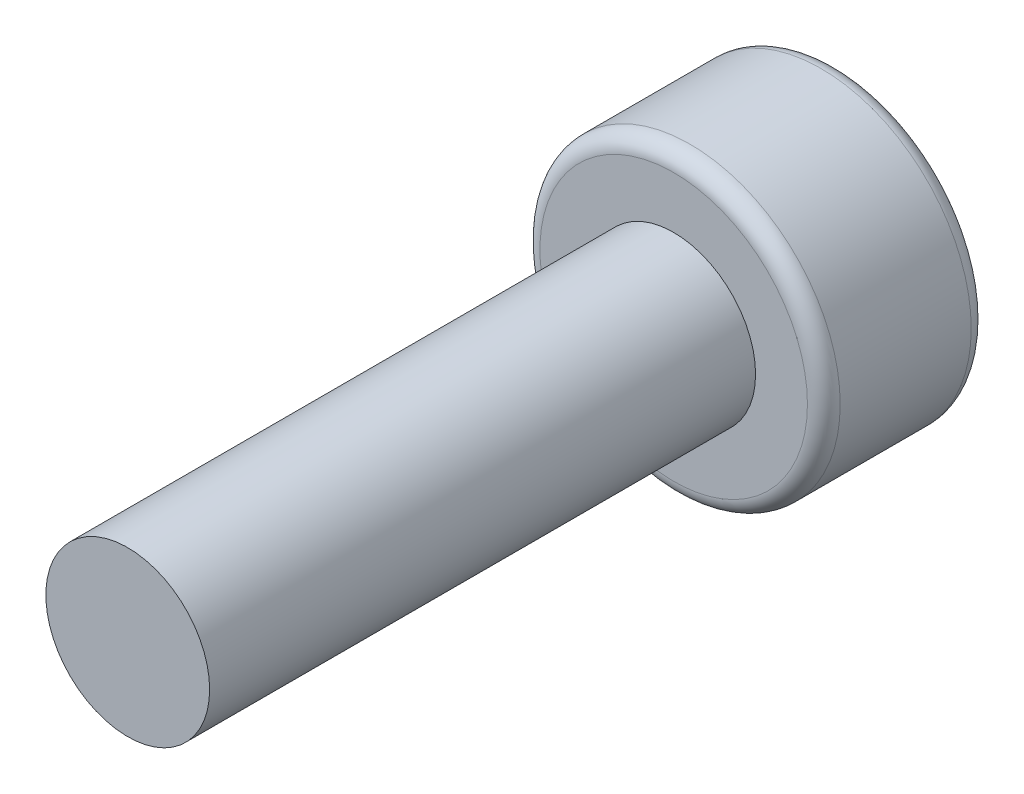
ISO-10303-21;
HEADER;
FILE_DESCRIPTION(('STEP AP214'),'2;1');
FILE_NAME('part.step','',(''),(''),'','','');
FILE_SCHEMA(('AUTOMOTIVE_DESIGN { 1 0 10303 214 1 1 1 1 }'));
ENDSEC;
DATA;
#1=APPLICATION_CONTEXT('core data for automotive mechanical design processes');
#2=APPLICATION_PROTOCOL_DEFINITION('international standard','automotive_design',2000,#1);
#3=PRODUCT_CONTEXT('',#1,'mechanical');
#4=PRODUCT('Part','Part','',(#3));
#5=PRODUCT_RELATED_PRODUCT_CATEGORY('part','',(#4));
#6=PRODUCT_DEFINITION_FORMATION('','',#4);
#7=PRODUCT_DEFINITION_CONTEXT('part definition',#1,'design');
#8=PRODUCT_DEFINITION('design','',#6,#7);
#9=PRODUCT_DEFINITION_SHAPE('','',#8);
#10=(LENGTH_UNIT() NAMED_UNIT(*) SI_UNIT(.MILLI.,.METRE.));
#11=(NAMED_UNIT(*) PLANE_ANGLE_UNIT() SI_UNIT($,.RADIAN.));
#12=(NAMED_UNIT(*) SI_UNIT($,.STERADIAN.) SOLID_ANGLE_UNIT());
#13=UNCERTAINTY_MEASURE_WITH_UNIT(LENGTH_MEASURE(1.E-05),#10,'distance_accuracy_value','');
#14=(GEOMETRIC_REPRESENTATION_CONTEXT(3) GLOBAL_UNCERTAINTY_ASSIGNED_CONTEXT((#13)) GLOBAL_UNIT_ASSIGNED_CONTEXT((#10,
#11,#12)) REPRESENTATION_CONTEXT('',''));
#15=CARTESIAN_POINT('',(0.,0.,0.));
#16=DIRECTION('',(0.,0.,1.));
#17=DIRECTION('',(1.,0.,0.));
#18=AXIS2_PLACEMENT_3D('',#15,#16,#17);
#19=CARTESIAN_POINT('',(0.,0.,3.));
#20=DIRECTION('',(0.,0.,-1.));
#21=DIRECTION('',(-1.,0.,0.));
#22=AXIS2_PLACEMENT_3D('',#19,#20,#21);
#23=CYLINDRICAL_SURFACE('',#22,2.75);
#24=CARTESIAN_POINT('',(0.,0.,0.3));
#25=DIRECTION('',(0.,0.,1.));
#26=DIRECTION('',(1.,0.,0.));
#27=AXIS2_PLACEMENT_3D('',#24,#25,#26);
#28=CIRCLE('',#27,2.75);
#29=CARTESIAN_POINT('',(2.75,0.,0.3));
#30=VERTEX_POINT('',#29);
#31=EDGE_CURVE('E155',#30,#30,#28,.T.);
#32=ORIENTED_EDGE('',*,*,#31,.T.);
#33=EDGE_LOOP('',(#32));
#34=FACE_BOUND('',#33,.T.);
#35=CARTESIAN_POINT('',(0.,0.,2.7));
#36=DIRECTION('',(0.,0.,1.));
#37=DIRECTION('',(1.,0.,0.));
#38=AXIS2_PLACEMENT_3D('',#35,#36,#37);
#39=CIRCLE('',#38,2.75);
#40=CARTESIAN_POINT('',(2.75,0.,2.7));
#41=VERTEX_POINT('',#40);
#42=EDGE_CURVE('E152',#41,#41,#39,.F.);
#43=ORIENTED_EDGE('',*,*,#42,.T.);
#44=EDGE_LOOP('',(#43));
#45=FACE_BOUND('',#44,.T.);
#46=ADVANCED_FACE('F39',(#34,#45),#23,.T.);
#47=CARTESIAN_POINT('',(0.,0.,3.));
#48=DIRECTION('',(0.,0.,1.));
#49=DIRECTION('',(1.,0.,0.));
#50=AXIS2_PLACEMENT_3D('',#47,#48,#49);
#51=PLANE('',#50);
#52=CARTESIAN_POINT('',(0.,0.,3.));
#53=DIRECTION('',(0.,0.,1.));
#54=DIRECTION('',(1.,0.,0.));
#55=AXIS2_PLACEMENT_3D('',#52,#53,#54);
#56=CIRCLE('',#55,2.45);
#57=CARTESIAN_POINT('',(2.45,0.,3.));
#58=VERTEX_POINT('',#57);
#59=EDGE_CURVE('E11',#58,#58,#56,.T.);
#60=ORIENTED_EDGE('',*,*,#59,.T.);
#61=EDGE_LOOP('',(#60));
#62=FACE_BOUND('',#61,.T.);
#63=CARTESIAN_POINT('',(0.,0.,3.));
#64=DIRECTION('',(0.,0.,1.));
#65=DIRECTION('',(1.,0.,0.));
#66=AXIS2_PLACEMENT_3D('',#63,#64,#65);
#67=CIRCLE('',#66,1.5);
#68=CARTESIAN_POINT('',(1.5,0.,3.));
#69=VERTEX_POINT('',#68);
#70=EDGE_CURVE('E149',#69,#69,#67,.T.);
#71=ORIENTED_EDGE('',*,*,#70,.F.);
#72=EDGE_LOOP('',(#71));
#73=FACE_BOUND('',#72,.T.);
#74=ADVANCED_FACE('F170',(#62,#73),#51,.T.);
#75=CARTESIAN_POINT('',(0.,0.,0.));
#76=DIRECTION('',(0.,0.,1.));
#77=DIRECTION('',(1.,0.,0.));
#78=AXIS2_PLACEMENT_3D('',#75,#76,#77);
#79=PLANE('',#78);
#80=DIRECTION('',(0.590811113127551,-0.806809908593706,0.));
#81=VECTOR('',#80,1.);
#82=CARTESIAN_POINT('',(0.820853493075304,1.8624081611757,0.));
#83=LINE('',#82,#81);
#84=CARTESIAN_POINT('',(0.820853493075304,1.8624081611757,0.));
#85=VERTEX_POINT('',#84);
#86=CARTESIAN_POINT('',(2.02331952633127,0.220324102799441,0.));
#87=VERTEX_POINT('',#86);
#88=EDGE_CURVE('E128',#85,#87,#83,.T.);
#89=ORIENTED_EDGE('',*,*,#88,.F.);
#90=DIRECTION('',(0.994123433430926,0.108252478509768,0.));
#91=VECTOR('',#90,1.);
#92=CARTESIAN_POINT('',(-1.20246603325596,1.64208405837626,0.));
#93=LINE('',#92,#91);
#94=CARTESIAN_POINT('',(-1.20246603325596,1.64208405837626,0.));
#95=VERTEX_POINT('',#94);
#96=EDGE_CURVE('E54',#95,#85,#93,.T.);
#97=ORIENTED_EDGE('',*,*,#96,.F.);
#98=DIRECTION('',(0.403312320303375,0.915062387103474,0.));
#99=VECTOR('',#98,1.);
#100=CARTESIAN_POINT('',(-2.02331952633127,-0.220324102799442,0.));
#101=LINE('',#100,#99);
#102=CARTESIAN_POINT('',(-2.02331952633127,-0.220324102799442,0.));
#103=VERTEX_POINT('',#102);
#104=EDGE_CURVE('E137',#103,#95,#101,.T.);
#105=ORIENTED_EDGE('',*,*,#104,.F.);
#106=DIRECTION('',(-0.590811113127551,0.806809908593706,0.));
#107=VECTOR('',#106,1.);
#108=CARTESIAN_POINT('',(-0.820853493075303,-1.8624081611757,0.));
#109=LINE('',#108,#107);
#110=CARTESIAN_POINT('',(-0.820853493075303,-1.8624081611757,0.));
#111=VERTEX_POINT('',#110);
#112=EDGE_CURVE('E135',#111,#103,#109,.T.);
#113=ORIENTED_EDGE('',*,*,#112,.F.);
#114=DIRECTION('',(-0.994123433430926,-0.108252478509768,0.));
#115=VECTOR('',#114,1.);
#116=CARTESIAN_POINT('',(1.20246603325596,-1.64208405837625,0.));
#117=LINE('',#116,#115);
#118=CARTESIAN_POINT('',(1.20246603325596,-1.64208405837625,0.));
#119=VERTEX_POINT('',#118);
#120=EDGE_CURVE('E102',#119,#111,#117,.T.);
#121=ORIENTED_EDGE('',*,*,#120,.F.);
#122=DIRECTION('',(-0.403312320303375,-0.915062387103474,0.));
#123=VECTOR('',#122,1.);
#124=CARTESIAN_POINT('',(2.02331952633127,0.220324102799441,0.));
#125=LINE('',#124,#123);
#126=EDGE_CURVE('E131',#87,#119,#125,.T.);
#127=ORIENTED_EDGE('',*,*,#126,.F.);
#128=EDGE_LOOP('',(#89,#97,#105,#113,#121,#127));
#129=FACE_BOUND('',#128,.T.);
#130=CARTESIAN_POINT('',(0.,0.,0.));
#131=DIRECTION('',(0.,0.,1.));
#132=DIRECTION('',(1.,0.,0.));
#133=AXIS2_PLACEMENT_3D('',#130,#131,#132);
#134=CIRCLE('',#133,2.45);
#135=CARTESIAN_POINT('',(2.45,0.,0.));
#136=VERTEX_POINT('',#135);
#137=EDGE_CURVE('E47',#136,#136,#134,.F.);
#138=ORIENTED_EDGE('',*,*,#137,.T.);
#139=EDGE_LOOP('',(#138));
#140=FACE_BOUND('',#139,.T.);
#141=ADVANCED_FACE('F160',(#129,#140),#79,.F.);
#142=CARTESIAN_POINT('',(0.,0.,13.));
#143=DIRECTION('',(0.,0.,-1.));
#144=DIRECTION('',(-1.,0.,0.));
#145=AXIS2_PLACEMENT_3D('',#142,#143,#144);
#146=CYLINDRICAL_SURFACE('',#145,1.5);
#147=CARTESIAN_POINT('',(0.,0.,13.));
#148=DIRECTION('',(0.,0.,1.));
#149=DIRECTION('',(1.,0.,0.));
#150=AXIS2_PLACEMENT_3D('',#147,#148,#149);
#151=CIRCLE('',#150,1.5);
#152=CARTESIAN_POINT('',(1.5,0.,13.));
#153=VERTEX_POINT('',#152);
#154=EDGE_CURVE('E141',#153,#153,#151,.T.);
#155=ORIENTED_EDGE('',*,*,#154,.F.);
#156=EDGE_LOOP('',(#155));
#157=FACE_BOUND('',#156,.T.);
#158=ORIENTED_EDGE('',*,*,#70,.T.);
#159=EDGE_LOOP('',(#158));
#160=FACE_BOUND('',#159,.T.);
#161=ADVANCED_FACE('F184',(#157,#160),#146,.T.);
#162=CARTESIAN_POINT('',(0.,0.,13.));
#163=DIRECTION('',(0.,0.,1.));
#164=DIRECTION('',(1.,0.,0.));
#165=AXIS2_PLACEMENT_3D('',#162,#163,#164);
#166=PLANE('',#165);
#167=ORIENTED_EDGE('',*,*,#154,.T.);
#168=EDGE_LOOP('',(#167));
#169=FACE_BOUND('',#168,.T.);
#170=ADVANCED_FACE('F165',(#169),#166,.T.);
#171=CARTESIAN_POINT('',(0.,0.,0.3));
#172=DIRECTION('',(0.,0.,1.));
#173=DIRECTION('',(1.,0.,0.));
#174=AXIS2_PLACEMENT_3D('',#171,#172,#173);
#175=TOROIDAL_SURFACE('',#174,2.45,0.3);
#176=ORIENTED_EDGE('',*,*,#137,.F.);
#177=EDGE_LOOP('',(#176));
#178=FACE_BOUND('',#177,.T.);
#179=ORIENTED_EDGE('',*,*,#31,.F.);
#180=EDGE_LOOP('',(#179));
#181=FACE_BOUND('',#180,.T.);
#182=ADVANCED_FACE('F162',(#178,#181),#175,.T.);
#183=CARTESIAN_POINT('',(0.,0.,2.7));
#184=DIRECTION('',(0.,0.,1.));
#185=DIRECTION('',(1.,0.,0.));
#186=AXIS2_PLACEMENT_3D('',#183,#184,#185);
#187=TOROIDAL_SURFACE('',#186,2.45,0.3);
#188=ORIENTED_EDGE('',*,*,#42,.F.);
#189=EDGE_LOOP('',(#188));
#190=FACE_BOUND('',#189,.T.);
#191=ORIENTED_EDGE('',*,*,#59,.F.);
#192=EDGE_LOOP('',(#191));
#193=FACE_BOUND('',#192,.T.);
#194=ADVANCED_FACE('F41',(#190,#193),#187,.T.);
#195=CARTESIAN_POINT('',(-1.20246603325596,1.64208405837626,2.));
#196=DIRECTION('',(-0.108252478509768,0.994123433430926,0.));
#197=DIRECTION('',(-0.994123433430926,-0.108252478509768,0.));
#198=AXIS2_PLACEMENT_3D('',#195,#196,#197);
#199=PLANE('',#198);
#200=ORIENTED_EDGE('',*,*,#96,.T.);
#201=DIRECTION('',(0.,0.,-1.));
#202=VECTOR('',#201,1.);
#203=CARTESIAN_POINT('',(0.820853493075304,1.8624081611757,2.));
#204=LINE('',#203,#202);
#205=CARTESIAN_POINT('',(0.820853493075304,1.8624081611757,2.));
#206=VERTEX_POINT('',#205);
#207=EDGE_CURVE('E84',#206,#85,#204,.T.);
#208=ORIENTED_EDGE('',*,*,#207,.F.);
#209=DIRECTION('',(0.994123433430926,0.108252478509768,0.));
#210=VECTOR('',#209,1.);
#211=CARTESIAN_POINT('',(-1.20246603325596,1.64208405837626,2.));
#212=LINE('',#211,#210);
#213=CARTESIAN_POINT('',(-1.20246603325596,1.64208405837626,2.));
#214=VERTEX_POINT('',#213);
#215=EDGE_CURVE('E139',#214,#206,#212,.T.);
#216=ORIENTED_EDGE('',*,*,#215,.F.);
#217=DIRECTION('',(0.,0.,-1.));
#218=VECTOR('',#217,1.);
#219=CARTESIAN_POINT('',(-1.20246603325596,1.64208405837626,2.));
#220=LINE('',#219,#218);
#221=EDGE_CURVE('E62',#214,#95,#220,.T.);
#222=ORIENTED_EDGE('',*,*,#221,.T.);
#223=EDGE_LOOP('',(#200,#208,#216,#222));
#224=FACE_BOUND('',#223,.T.);
#225=ADVANCED_FACE('F176',(#224),#199,.F.);
#226=CARTESIAN_POINT('',(-2.02331952633127,-0.220324102799442,2.));
#227=DIRECTION('',(-0.915062387103474,0.403312320303375,0.));
#228=DIRECTION('',(-0.403312320303375,-0.915062387103474,0.));
#229=AXIS2_PLACEMENT_3D('',#226,#227,#228);
#230=PLANE('',#229);
#231=ORIENTED_EDGE('',*,*,#104,.T.);
#232=ORIENTED_EDGE('',*,*,#221,.F.);
#233=DIRECTION('',(0.403312320303375,0.915062387103474,0.));
#234=VECTOR('',#233,1.);
#235=CARTESIAN_POINT('',(-2.02331952633127,-0.220324102799442,2.));
#236=LINE('',#235,#234);
#237=CARTESIAN_POINT('',(-2.02331952633127,-0.220324102799442,2.));
#238=VERTEX_POINT('',#237);
#239=EDGE_CURVE('E114',#238,#214,#236,.T.);
#240=ORIENTED_EDGE('',*,*,#239,.F.);
#241=DIRECTION('',(0.,0.,-1.));
#242=VECTOR('',#241,1.);
#243=CARTESIAN_POINT('',(-2.02331952633127,-0.220324102799442,2.));
#244=LINE('',#243,#242);
#245=EDGE_CURVE('E106',#238,#103,#244,.T.);
#246=ORIENTED_EDGE('',*,*,#245,.T.);
#247=EDGE_LOOP('',(#231,#232,#240,#246));
#248=FACE_BOUND('',#247,.T.);
#249=ADVANCED_FACE('F200',(#248),#230,.F.);
#250=CARTESIAN_POINT('',(-0.820853493075303,-1.8624081611757,2.));
#251=DIRECTION('',(-0.806809908593706,-0.590811113127551,0.));
#252=DIRECTION('',(0.590811113127551,-0.806809908593706,0.));
#253=AXIS2_PLACEMENT_3D('',#250,#251,#252);
#254=PLANE('',#253);
#255=ORIENTED_EDGE('',*,*,#112,.T.);
#256=ORIENTED_EDGE('',*,*,#245,.F.);
#257=DIRECTION('',(-0.590811113127551,0.806809908593706,0.));
#258=VECTOR('',#257,1.);
#259=CARTESIAN_POINT('',(-0.820853493075303,-1.8624081611757,2.));
#260=LINE('',#259,#258);
#261=CARTESIAN_POINT('',(-0.820853493075303,-1.8624081611757,2.));
#262=VERTEX_POINT('',#261);
#263=EDGE_CURVE('E110',#262,#238,#260,.T.);
#264=ORIENTED_EDGE('',*,*,#263,.F.);
#265=DIRECTION('',(0.,0.,-1.));
#266=VECTOR('',#265,1.);
#267=CARTESIAN_POINT('',(-0.820853493075303,-1.8624081611757,2.));
#268=LINE('',#267,#266);
#269=EDGE_CURVE('E95',#262,#111,#268,.T.);
#270=ORIENTED_EDGE('',*,*,#269,.T.);
#271=EDGE_LOOP('',(#255,#256,#264,#270));
#272=FACE_BOUND('',#271,.T.);
#273=ADVANCED_FACE('F111',(#272),#254,.F.);
#274=CARTESIAN_POINT('',(1.20246603325596,-1.64208405837625,2.));
#275=DIRECTION('',(0.108252478509768,-0.994123433430926,0.));
#276=DIRECTION('',(0.994123433430926,0.108252478509768,0.));
#277=AXIS2_PLACEMENT_3D('',#274,#275,#276);
#278=PLANE('',#277);
#279=ORIENTED_EDGE('',*,*,#120,.T.);
#280=ORIENTED_EDGE('',*,*,#269,.F.);
#281=DIRECTION('',(-0.994123433430926,-0.108252478509768,0.));
#282=VECTOR('',#281,1.);
#283=CARTESIAN_POINT('',(1.20246603325596,-1.64208405837625,2.));
#284=LINE('',#283,#282);
#285=CARTESIAN_POINT('',(1.20246603325596,-1.64208405837625,2.));
#286=VERTEX_POINT('',#285);
#287=EDGE_CURVE('E99',#286,#262,#284,.T.);
#288=ORIENTED_EDGE('',*,*,#287,.F.);
#289=DIRECTION('',(0.,0.,-1.));
#290=VECTOR('',#289,1.);
#291=CARTESIAN_POINT('',(1.20246603325596,-1.64208405837625,2.));
#292=LINE('',#291,#290);
#293=EDGE_CURVE('E107',#286,#119,#292,.T.);
#294=ORIENTED_EDGE('',*,*,#293,.T.);
#295=EDGE_LOOP('',(#279,#280,#288,#294));
#296=FACE_BOUND('',#295,.T.);
#297=ADVANCED_FACE('F97',(#296),#278,.F.);
#298=CARTESIAN_POINT('',(2.02331952633127,0.220324102799441,2.));
#299=DIRECTION('',(0.915062387103474,-0.403312320303375,0.));
#300=DIRECTION('',(0.403312320303375,0.915062387103474,0.));
#301=AXIS2_PLACEMENT_3D('',#298,#299,#300);
#302=PLANE('',#301);
#303=ORIENTED_EDGE('',*,*,#126,.T.);
#304=ORIENTED_EDGE('',*,*,#293,.F.);
#305=DIRECTION('',(-0.403312320303375,-0.915062387103474,0.));
#306=VECTOR('',#305,1.);
#307=CARTESIAN_POINT('',(2.02331952633127,0.220324102799441,2.));
#308=LINE('',#307,#306);
#309=CARTESIAN_POINT('',(2.02331952633127,0.220324102799441,2.));
#310=VERTEX_POINT('',#309);
#311=EDGE_CURVE('E120',#310,#286,#308,.T.);
#312=ORIENTED_EDGE('',*,*,#311,.F.);
#313=DIRECTION('',(0.,0.,-1.));
#314=VECTOR('',#313,1.);
#315=CARTESIAN_POINT('',(2.02331952633127,0.220324102799441,2.));
#316=LINE('',#315,#314);
#317=EDGE_CURVE('E144',#310,#87,#316,.T.);
#318=ORIENTED_EDGE('',*,*,#317,.T.);
#319=EDGE_LOOP('',(#303,#304,#312,#318));
#320=FACE_BOUND('',#319,.T.);
#321=ADVANCED_FACE('F204',(#320),#302,.F.);
#322=CARTESIAN_POINT('',(0.820853493075304,1.8624081611757,2.));
#323=DIRECTION('',(0.806809908593706,0.590811113127551,0.));
#324=DIRECTION('',(-0.590811113127551,0.806809908593706,0.));
#325=AXIS2_PLACEMENT_3D('',#322,#323,#324);
#326=PLANE('',#325);
#327=ORIENTED_EDGE('',*,*,#88,.T.);
#328=ORIENTED_EDGE('',*,*,#317,.F.);
#329=DIRECTION('',(0.590811113127551,-0.806809908593706,0.));
#330=VECTOR('',#329,1.);
#331=CARTESIAN_POINT('',(0.820853493075304,1.8624081611757,2.));
#332=LINE('',#331,#330);
#333=EDGE_CURVE('E122',#206,#310,#332,.T.);
#334=ORIENTED_EDGE('',*,*,#333,.F.);
#335=ORIENTED_EDGE('',*,*,#207,.T.);
#336=EDGE_LOOP('',(#327,#328,#334,#335));
#337=FACE_BOUND('',#336,.T.);
#338=ADVANCED_FACE('F201',(#337),#326,.F.);
#339=CARTESIAN_POINT('',(0.,0.,2.));
#340=DIRECTION('',(0.,0.,-1.));
#341=DIRECTION('',(-1.,0.,0.));
#342=AXIS2_PLACEMENT_3D('',#339,#340,#341);
#343=PLANE('',#342);
#344=ORIENTED_EDGE('',*,*,#215,.T.);
#345=ORIENTED_EDGE('',*,*,#333,.T.);
#346=ORIENTED_EDGE('',*,*,#311,.T.);
#347=ORIENTED_EDGE('',*,*,#287,.T.);
#348=ORIENTED_EDGE('',*,*,#263,.T.);
#349=ORIENTED_EDGE('',*,*,#239,.T.);
#350=EDGE_LOOP('',(#344,#345,#346,#347,#348,#349));
#351=FACE_BOUND('',#350,.T.);
#352=ADVANCED_FACE('F117',(#351),#343,.T.);
#353=CLOSED_SHELL('',(#46,#74,#141,#161,#170,#182,#194,#225,#249,#273,#297,#321,#338,#352));
#354=MANIFOLD_SOLID_BREP('B2',#353);
#355=ADVANCED_BREP_SHAPE_REPRESENTATION('',(#18,#354),#14);
#356=SHAPE_DEFINITION_REPRESENTATION(#9,#355);
ENDSEC;
END-ISO-10303-21;
